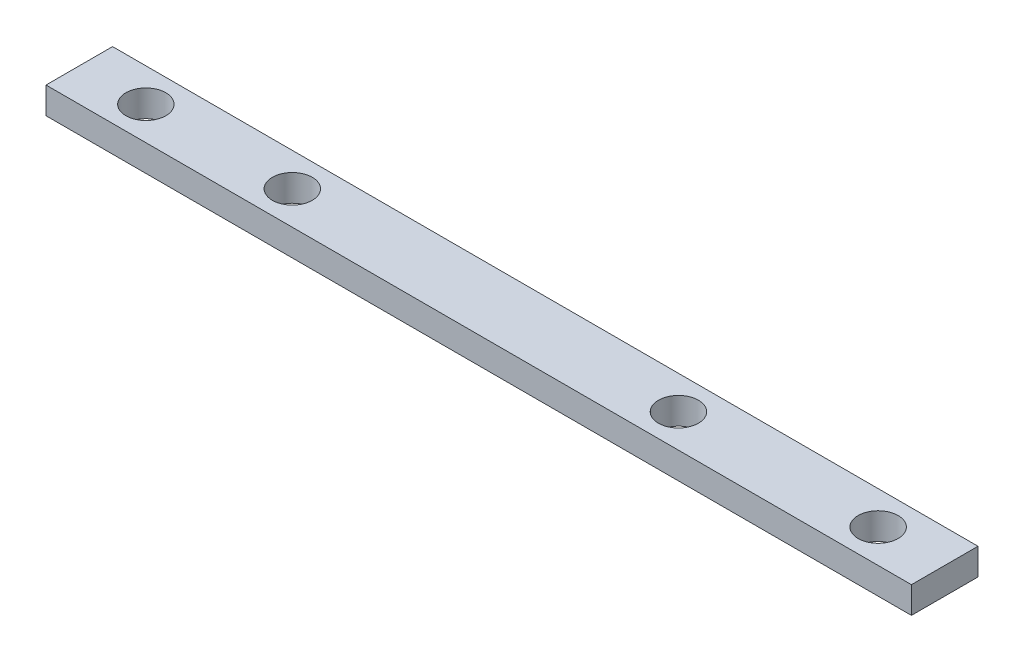
ISO-10303-21;
HEADER;
FILE_DESCRIPTION(('STEP AP214'),'2;1');
FILE_NAME('part.step','',(''),(''),'','','');
FILE_SCHEMA(('AUTOMOTIVE_DESIGN { 1 0 10303 214 1 1 1 1 }'));
ENDSEC;
DATA;
#1=APPLICATION_CONTEXT('core data for automotive mechanical design processes');
#2=APPLICATION_PROTOCOL_DEFINITION('international standard','automotive_design',2000,#1);
#3=PRODUCT_CONTEXT('',#1,'mechanical');
#4=PRODUCT('Part','Part','',(#3));
#5=PRODUCT_RELATED_PRODUCT_CATEGORY('part','',(#4));
#6=PRODUCT_DEFINITION_FORMATION('','',#4);
#7=PRODUCT_DEFINITION_CONTEXT('part definition',#1,'design');
#8=PRODUCT_DEFINITION('design','',#6,#7);
#9=PRODUCT_DEFINITION_SHAPE('','',#8);
#10=(LENGTH_UNIT() NAMED_UNIT(*) SI_UNIT(.MILLI.,.METRE.));
#11=(NAMED_UNIT(*) PLANE_ANGLE_UNIT() SI_UNIT($,.RADIAN.));
#12=(NAMED_UNIT(*) SI_UNIT($,.STERADIAN.) SOLID_ANGLE_UNIT());
#13=UNCERTAINTY_MEASURE_WITH_UNIT(LENGTH_MEASURE(1.E-05),#10,'distance_accuracy_value','');
#14=(GEOMETRIC_REPRESENTATION_CONTEXT(3) GLOBAL_UNCERTAINTY_ASSIGNED_CONTEXT((#13)) GLOBAL_UNIT_ASSIGNED_CONTEXT((#10,
#11,#12)) REPRESENTATION_CONTEXT('',''));
#15=CARTESIAN_POINT('',(0.,0.,0.));
#16=DIRECTION('',(0.,0.,1.));
#17=DIRECTION('',(1.,0.,0.));
#18=AXIS2_PLACEMENT_3D('',#15,#16,#17);
#19=CARTESIAN_POINT('',(0.,2.,0.));
#20=DIRECTION('',(0.,-1.,0.));
#21=DIRECTION('',(0.,0.,-1.));
#22=AXIS2_PLACEMENT_3D('',#19,#20,#21);
#23=PLANE('',#22);
#24=DIRECTION('',(0.,0.,-1.));
#25=VECTOR('',#24,1.);
#26=CARTESIAN_POINT('',(0.,2.,5.));
#27=LINE('',#26,#25);
#28=CARTESIAN_POINT('',(0.,2.,5.));
#29=VERTEX_POINT('',#28);
#30=CARTESIAN_POINT('',(0.,2.,0.));
#31=VERTEX_POINT('',#30);
#32=EDGE_CURVE('E156',#29,#31,#27,.T.);
#33=ORIENTED_EDGE('',*,*,#32,.F.);
#34=DIRECTION('',(1.,0.,0.));
#35=VECTOR('',#34,1.);
#36=CARTESIAN_POINT('',(0.,2.,5.));
#37=LINE('',#36,#35);
#38=CARTESIAN_POINT('',(65.,2.,5.));
#39=VERTEX_POINT('',#38);
#40=EDGE_CURVE('E146',#29,#39,#37,.T.);
#41=ORIENTED_EDGE('',*,*,#40,.T.);
#42=DIRECTION('',(0.,0.,-1.));
#43=VECTOR('',#42,1.);
#44=CARTESIAN_POINT('',(65.,2.,5.));
#45=LINE('',#44,#43);
#46=CARTESIAN_POINT('',(65.,2.,0.));
#47=VERTEX_POINT('',#46);
#48=EDGE_CURVE('E141',#39,#47,#45,.T.);
#49=ORIENTED_EDGE('',*,*,#48,.T.);
#50=DIRECTION('',(1.,0.,0.));
#51=VECTOR('',#50,1.);
#52=CARTESIAN_POINT('',(0.,2.,0.));
#53=LINE('',#52,#51);
#54=EDGE_CURVE('E145',#31,#47,#53,.T.);
#55=ORIENTED_EDGE('',*,*,#54,.F.);
#56=EDGE_LOOP('',(#33,#41,#49,#55));
#57=FACE_BOUND('',#56,.T.);
#58=CARTESIAN_POINT('',(5.,2.,2.5));
#59=DIRECTION('',(0.,1.,0.));
#60=DIRECTION('',(0.,0.,1.));
#61=AXIS2_PLACEMENT_3D('',#58,#59,#60);
#62=CIRCLE('',#61,1.5);
#63=CARTESIAN_POINT('',(5.,2.,4.));
#64=VERTEX_POINT('',#63);
#65=EDGE_CURVE('E166',#64,#64,#62,.T.);
#66=ORIENTED_EDGE('',*,*,#65,.F.);
#67=EDGE_LOOP('',(#66));
#68=FACE_BOUND('',#67,.T.);
#69=CARTESIAN_POINT('',(16.,2.,2.5));
#70=DIRECTION('',(0.,1.,0.));
#71=DIRECTION('',(0.,0.,1.));
#72=AXIS2_PLACEMENT_3D('',#69,#70,#71);
#73=CIRCLE('',#72,1.5);
#74=CARTESIAN_POINT('',(16.,2.,4.));
#75=VERTEX_POINT('',#74);
#76=EDGE_CURVE('E209',#75,#75,#73,.T.);
#77=ORIENTED_EDGE('',*,*,#76,.F.);
#78=EDGE_LOOP('',(#77));
#79=FACE_BOUND('',#78,.T.);
#80=CARTESIAN_POINT('',(45.,2.,2.5));
#81=DIRECTION('',(0.,1.,0.));
#82=DIRECTION('',(0.,0.,1.));
#83=AXIS2_PLACEMENT_3D('',#80,#81,#82);
#84=CIRCLE('',#83,1.5);
#85=CARTESIAN_POINT('',(45.,2.,4.));
#86=VERTEX_POINT('',#85);
#87=EDGE_CURVE('E216',#86,#86,#84,.T.);
#88=ORIENTED_EDGE('',*,*,#87,.F.);
#89=EDGE_LOOP('',(#88));
#90=FACE_BOUND('',#89,.T.);
#91=CARTESIAN_POINT('',(60.,2.,2.5));
#92=DIRECTION('',(0.,1.,0.));
#93=DIRECTION('',(0.,0.,1.));
#94=AXIS2_PLACEMENT_3D('',#91,#92,#93);
#95=CIRCLE('',#94,1.5);
#96=CARTESIAN_POINT('',(60.,2.,4.));
#97=VERTEX_POINT('',#96);
#98=EDGE_CURVE('E221',#97,#97,#95,.T.);
#99=ORIENTED_EDGE('',*,*,#98,.F.);
#100=EDGE_LOOP('',(#99));
#101=FACE_BOUND('',#100,.T.);
#102=ADVANCED_FACE('F95',(#57,#68,#79,#90,#101),#23,.F.);
#103=CARTESIAN_POINT('',(0.,0.,0.));
#104=DIRECTION('',(0.,-1.,0.));
#105=DIRECTION('',(0.,0.,-1.));
#106=AXIS2_PLACEMENT_3D('',#103,#104,#105);
#107=PLANE('',#106);
#108=CARTESIAN_POINT('',(45.,0.,2.5));
#109=DIRECTION('',(0.,1.,0.));
#110=DIRECTION('',(0.,0.,1.));
#111=AXIS2_PLACEMENT_3D('',#108,#109,#110);
#112=CIRCLE('',#111,1.5);
#113=CARTESIAN_POINT('',(45.,0.,4.));
#114=VERTEX_POINT('',#113);
#115=EDGE_CURVE('E218',#114,#114,#112,.T.);
#116=ORIENTED_EDGE('',*,*,#115,.T.);
#117=EDGE_LOOP('',(#116));
#118=FACE_BOUND('',#117,.T.);
#119=CARTESIAN_POINT('',(5.,0.,2.5));
#120=DIRECTION('',(0.,1.,0.));
#121=DIRECTION('',(0.,0.,1.));
#122=AXIS2_PLACEMENT_3D('',#119,#120,#121);
#123=CIRCLE('',#122,1.5);
#124=CARTESIAN_POINT('',(5.,0.,4.));
#125=VERTEX_POINT('',#124);
#126=EDGE_CURVE('E207',#125,#125,#123,.T.);
#127=ORIENTED_EDGE('',*,*,#126,.T.);
#128=EDGE_LOOP('',(#127));
#129=FACE_BOUND('',#128,.T.);
#130=DIRECTION('',(0.,0.,-1.));
#131=VECTOR('',#130,1.);
#132=CARTESIAN_POINT('',(0.,0.,5.));
#133=LINE('',#132,#131);
#134=CARTESIAN_POINT('',(0.,0.,5.));
#135=VERTEX_POINT('',#134);
#136=CARTESIAN_POINT('',(0.,0.,0.));
#137=VERTEX_POINT('',#136);
#138=EDGE_CURVE('E162',#135,#137,#133,.T.);
#139=ORIENTED_EDGE('',*,*,#138,.T.);
#140=DIRECTION('',(1.,0.,0.));
#141=VECTOR('',#140,1.);
#142=CARTESIAN_POINT('',(0.,0.,0.));
#143=LINE('',#142,#141);
#144=CARTESIAN_POINT('',(65.,0.,0.));
#145=VERTEX_POINT('',#144);
#146=EDGE_CURVE('E165',#137,#145,#143,.T.);
#147=ORIENTED_EDGE('',*,*,#146,.T.);
#148=DIRECTION('',(0.,0.,-1.));
#149=VECTOR('',#148,1.);
#150=CARTESIAN_POINT('',(65.,0.,5.));
#151=LINE('',#150,#149);
#152=CARTESIAN_POINT('',(65.,0.,5.));
#153=VERTEX_POINT('',#152);
#154=EDGE_CURVE('E153',#153,#145,#151,.T.);
#155=ORIENTED_EDGE('',*,*,#154,.F.);
#156=DIRECTION('',(1.,0.,0.));
#157=VECTOR('',#156,1.);
#158=CARTESIAN_POINT('',(0.,0.,5.));
#159=LINE('',#158,#157);
#160=EDGE_CURVE('E129',#135,#153,#159,.T.);
#161=ORIENTED_EDGE('',*,*,#160,.F.);
#162=EDGE_LOOP('',(#139,#147,#155,#161));
#163=FACE_BOUND('',#162,.T.);
#164=CARTESIAN_POINT('',(16.,0.,2.5));
#165=DIRECTION('',(0.,1.,0.));
#166=DIRECTION('',(0.,0.,1.));
#167=AXIS2_PLACEMENT_3D('',#164,#165,#166);
#168=CIRCLE('',#167,1.5);
#169=CARTESIAN_POINT('',(16.,0.,4.));
#170=VERTEX_POINT('',#169);
#171=EDGE_CURVE('E212',#170,#170,#168,.T.);
#172=ORIENTED_EDGE('',*,*,#171,.T.);
#173=EDGE_LOOP('',(#172));
#174=FACE_BOUND('',#173,.T.);
#175=CARTESIAN_POINT('',(60.,0.,2.5));
#176=DIRECTION('',(0.,1.,0.));
#177=DIRECTION('',(0.,0.,1.));
#178=AXIS2_PLACEMENT_3D('',#175,#176,#177);
#179=CIRCLE('',#178,1.5);
#180=CARTESIAN_POINT('',(60.,0.,4.));
#181=VERTEX_POINT('',#180);
#182=EDGE_CURVE('E224',#181,#181,#179,.T.);
#183=ORIENTED_EDGE('',*,*,#182,.T.);
#184=EDGE_LOOP('',(#183));
#185=FACE_BOUND('',#184,.T.);
#186=ADVANCED_FACE('F171',(#118,#129,#163,#174,#185),#107,.T.);
#187=CARTESIAN_POINT('',(0.,2.,5.));
#188=DIRECTION('',(-1.,0.,0.));
#189=DIRECTION('',(0.,0.,1.));
#190=AXIS2_PLACEMENT_3D('',#187,#188,#189);
#191=PLANE('',#190);
#192=ORIENTED_EDGE('',*,*,#138,.F.);
#193=DIRECTION('',(0.,-1.,0.));
#194=VECTOR('',#193,1.);
#195=CARTESIAN_POINT('',(0.,2.,5.));
#196=LINE('',#195,#194);
#197=EDGE_CURVE('E12',#29,#135,#196,.T.);
#198=ORIENTED_EDGE('',*,*,#197,.F.);
#199=ORIENTED_EDGE('',*,*,#32,.T.);
#200=DIRECTION('',(0.,-1.,0.));
#201=VECTOR('',#200,1.);
#202=CARTESIAN_POINT('',(0.,2.,0.));
#203=LINE('',#202,#201);
#204=EDGE_CURVE('E99',#31,#137,#203,.T.);
#205=ORIENTED_EDGE('',*,*,#204,.T.);
#206=EDGE_LOOP('',(#192,#198,#199,#205));
#207=FACE_BOUND('',#206,.T.);
#208=ADVANCED_FACE('F97',(#207),#191,.T.);
#209=CARTESIAN_POINT('',(0.,2.,5.));
#210=DIRECTION('',(0.,0.,-1.));
#211=DIRECTION('',(-1.,0.,0.));
#212=AXIS2_PLACEMENT_3D('',#209,#210,#211);
#213=PLANE('',#212);
#214=ORIENTED_EDGE('',*,*,#160,.T.);
#215=DIRECTION('',(0.,-1.,0.));
#216=VECTOR('',#215,1.);
#217=CARTESIAN_POINT('',(65.,2.,5.));
#218=LINE('',#217,#216);
#219=EDGE_CURVE('E105',#39,#153,#218,.T.);
#220=ORIENTED_EDGE('',*,*,#219,.F.);
#221=ORIENTED_EDGE('',*,*,#40,.F.);
#222=ORIENTED_EDGE('',*,*,#197,.T.);
#223=EDGE_LOOP('',(#214,#220,#221,#222));
#224=FACE_BOUND('',#223,.T.);
#225=ADVANCED_FACE('F174',(#224),#213,.F.);
#226=CARTESIAN_POINT('',(65.,2.,5.));
#227=DIRECTION('',(-1.,0.,0.));
#228=DIRECTION('',(0.,0.,1.));
#229=AXIS2_PLACEMENT_3D('',#226,#227,#228);
#230=PLANE('',#229);
#231=ORIENTED_EDGE('',*,*,#154,.T.);
#232=DIRECTION('',(0.,-1.,0.));
#233=VECTOR('',#232,1.);
#234=CARTESIAN_POINT('',(65.,2.,0.));
#235=LINE('',#234,#233);
#236=EDGE_CURVE('E150',#47,#145,#235,.T.);
#237=ORIENTED_EDGE('',*,*,#236,.F.);
#238=ORIENTED_EDGE('',*,*,#48,.F.);
#239=ORIENTED_EDGE('',*,*,#219,.T.);
#240=EDGE_LOOP('',(#231,#237,#238,#239));
#241=FACE_BOUND('',#240,.T.);
#242=ADVANCED_FACE('F151',(#241),#230,.F.);
#243=CARTESIAN_POINT('',(0.,2.,0.));
#244=DIRECTION('',(0.,0.,-1.));
#245=DIRECTION('',(-1.,0.,0.));
#246=AXIS2_PLACEMENT_3D('',#243,#244,#245);
#247=PLANE('',#246);
#248=ORIENTED_EDGE('',*,*,#146,.F.);
#249=ORIENTED_EDGE('',*,*,#204,.F.);
#250=ORIENTED_EDGE('',*,*,#54,.T.);
#251=ORIENTED_EDGE('',*,*,#236,.T.);
#252=EDGE_LOOP('',(#248,#249,#250,#251));
#253=FACE_BOUND('',#252,.T.);
#254=ADVANCED_FACE('F155',(#253),#247,.T.);
#255=CARTESIAN_POINT('',(5.,2.,2.5));
#256=DIRECTION('',(0.,-1.,0.));
#257=DIRECTION('',(0.,0.,-1.));
#258=AXIS2_PLACEMENT_3D('',#255,#256,#257);
#259=CYLINDRICAL_SURFACE('',#258,1.5);
#260=ORIENTED_EDGE('',*,*,#65,.T.);
#261=EDGE_LOOP('',(#260));
#262=FACE_BOUND('',#261,.T.);
#263=ORIENTED_EDGE('',*,*,#126,.F.);
#264=EDGE_LOOP('',(#263));
#265=FACE_BOUND('',#264,.T.);
#266=ADVANCED_FACE('F187',(#262,#265),#259,.F.);
#267=CARTESIAN_POINT('',(16.,2.,2.5));
#268=DIRECTION('',(0.,-1.,0.));
#269=DIRECTION('',(0.,0.,-1.));
#270=AXIS2_PLACEMENT_3D('',#267,#268,#269);
#271=CYLINDRICAL_SURFACE('',#270,1.5);
#272=ORIENTED_EDGE('',*,*,#76,.T.);
#273=EDGE_LOOP('',(#272));
#274=FACE_BOUND('',#273,.T.);
#275=ORIENTED_EDGE('',*,*,#171,.F.);
#276=EDGE_LOOP('',(#275));
#277=FACE_BOUND('',#276,.T.);
#278=ADVANCED_FACE('F195',(#274,#277),#271,.F.);
#279=CARTESIAN_POINT('',(45.,2.,2.5));
#280=DIRECTION('',(0.,-1.,0.));
#281=DIRECTION('',(0.,0.,-1.));
#282=AXIS2_PLACEMENT_3D('',#279,#280,#281);
#283=CYLINDRICAL_SURFACE('',#282,1.5);
#284=ORIENTED_EDGE('',*,*,#87,.T.);
#285=EDGE_LOOP('',(#284));
#286=FACE_BOUND('',#285,.T.);
#287=ORIENTED_EDGE('',*,*,#115,.F.);
#288=EDGE_LOOP('',(#287));
#289=FACE_BOUND('',#288,.T.);
#290=ADVANCED_FACE('F200',(#286,#289),#283,.F.);
#291=CARTESIAN_POINT('',(60.,2.,2.5));
#292=DIRECTION('',(0.,-1.,0.));
#293=DIRECTION('',(0.,0.,-1.));
#294=AXIS2_PLACEMENT_3D('',#291,#292,#293);
#295=CYLINDRICAL_SURFACE('',#294,1.5);
#296=ORIENTED_EDGE('',*,*,#98,.T.);
#297=EDGE_LOOP('',(#296));
#298=FACE_BOUND('',#297,.T.);
#299=ORIENTED_EDGE('',*,*,#182,.F.);
#300=EDGE_LOOP('',(#299));
#301=FACE_BOUND('',#300,.T.);
#302=ADVANCED_FACE('F230',(#298,#301),#295,.F.);
#303=CLOSED_SHELL('',(#102,#186,#208,#225,#242,#254,#266,#278,#290,#302));
#304=MANIFOLD_SOLID_BREP('B2',#303);
#305=ADVANCED_BREP_SHAPE_REPRESENTATION('',(#18,#304),#14);
#306=SHAPE_DEFINITION_REPRESENTATION(#9,#305);
ENDSEC;
END-ISO-10303-21;
